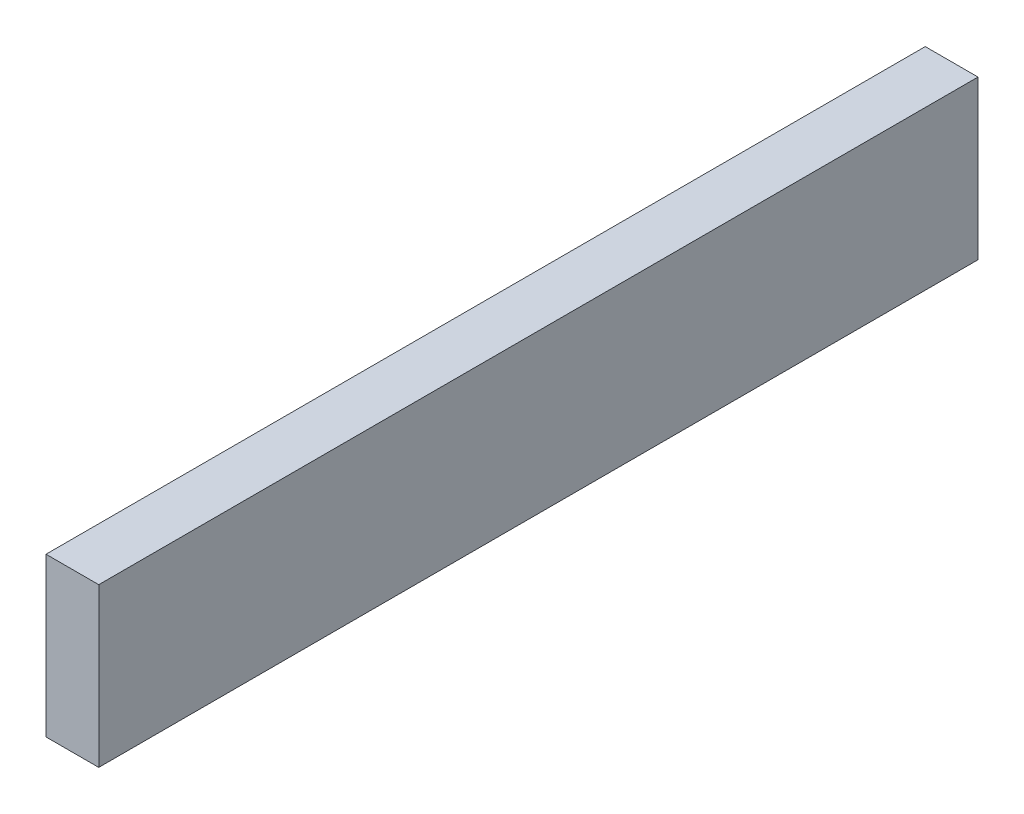
ISO-10303-21;
HEADER;
FILE_DESCRIPTION(('STEP AP214'),'2;1');
FILE_NAME('part.step','',(''),(''),'','','');
FILE_SCHEMA(('AUTOMOTIVE_DESIGN { 1 0 10303 214 1 1 1 1 }'));
ENDSEC;
DATA;
#1=APPLICATION_CONTEXT('core data for automotive mechanical design processes');
#2=APPLICATION_PROTOCOL_DEFINITION('international standard','automotive_design',2000,#1);
#3=PRODUCT_CONTEXT('',#1,'mechanical');
#4=PRODUCT('Part','Part','',(#3));
#5=PRODUCT_RELATED_PRODUCT_CATEGORY('part','',(#4));
#6=PRODUCT_DEFINITION_FORMATION('','',#4);
#7=PRODUCT_DEFINITION_CONTEXT('part definition',#1,'design');
#8=PRODUCT_DEFINITION('design','',#6,#7);
#9=PRODUCT_DEFINITION_SHAPE('','',#8);
#10=(LENGTH_UNIT() NAMED_UNIT(*) SI_UNIT(.MILLI.,.METRE.));
#11=(NAMED_UNIT(*) PLANE_ANGLE_UNIT() SI_UNIT($,.RADIAN.));
#12=(NAMED_UNIT(*) SI_UNIT($,.STERADIAN.) SOLID_ANGLE_UNIT());
#13=UNCERTAINTY_MEASURE_WITH_UNIT(LENGTH_MEASURE(1.E-05),#10,'distance_accuracy_value','');
#14=(GEOMETRIC_REPRESENTATION_CONTEXT(3) GLOBAL_UNCERTAINTY_ASSIGNED_CONTEXT((#13)) GLOBAL_UNIT_ASSIGNED_CONTEXT((#10,
#11,#12)) REPRESENTATION_CONTEXT('',''));
#15=CARTESIAN_POINT('',(0.,0.,0.));
#16=DIRECTION('',(0.,0.,1.));
#17=DIRECTION('',(1.,0.,0.));
#18=AXIS2_PLACEMENT_3D('',#15,#16,#17);
#19=CARTESIAN_POINT('',(15.,-45.,250.));
#20=DIRECTION('',(-1.,0.,0.));
#21=DIRECTION('',(0.,0.,1.));
#22=AXIS2_PLACEMENT_3D('',#19,#20,#21);
#23=PLANE('',#22);
#24=DIRECTION('',(0.,1.,0.));
#25=VECTOR('',#24,1.);
#26=CARTESIAN_POINT('',(15.,-45.,-250.));
#27=LINE('',#26,#25);
#28=CARTESIAN_POINT('',(15.,-45.,-250.));
#29=VERTEX_POINT('',#28);
#30=CARTESIAN_POINT('',(15.,45.,-250.));
#31=VERTEX_POINT('',#30);
#32=EDGE_CURVE('E96',#29,#31,#27,.T.);
#33=ORIENTED_EDGE('',*,*,#32,.T.);
#34=DIRECTION('',(0.,0.,-1.));
#35=VECTOR('',#34,1.);
#36=CARTESIAN_POINT('',(15.,45.,250.));
#37=LINE('',#36,#35);
#38=CARTESIAN_POINT('',(15.,45.,250.));
#39=VERTEX_POINT('',#38);
#40=EDGE_CURVE('E11',#39,#31,#37,.T.);
#41=ORIENTED_EDGE('',*,*,#40,.F.);
#42=DIRECTION('',(0.,1.,0.));
#43=VECTOR('',#42,1.);
#44=CARTESIAN_POINT('',(15.,-45.,250.));
#45=LINE('',#44,#43);
#46=CARTESIAN_POINT('',(15.,-45.,250.));
#47=VERTEX_POINT('',#46);
#48=EDGE_CURVE('E84',#47,#39,#45,.T.);
#49=ORIENTED_EDGE('',*,*,#48,.F.);
#50=DIRECTION('',(0.,0.,-1.));
#51=VECTOR('',#50,1.);
#52=CARTESIAN_POINT('',(15.,-45.,250.));
#53=LINE('',#52,#51);
#54=EDGE_CURVE('E92',#47,#29,#53,.T.);
#55=ORIENTED_EDGE('',*,*,#54,.T.);
#56=EDGE_LOOP('',(#33,#41,#49,#55));
#57=FACE_BOUND('',#56,.T.);
#58=ADVANCED_FACE('F33',(#57),#23,.F.);
#59=CARTESIAN_POINT('',(-15.,45.,250.));
#60=DIRECTION('',(0.,-1.,0.));
#61=DIRECTION('',(0.,0.,-1.));
#62=AXIS2_PLACEMENT_3D('',#59,#60,#61);
#63=PLANE('',#62);
#64=DIRECTION('',(-1.,0.,0.));
#65=VECTOR('',#64,1.);
#66=CARTESIAN_POINT('',(-15.,45.,-250.));
#67=LINE('',#66,#65);
#68=CARTESIAN_POINT('',(-15.,45.,-250.));
#69=VERTEX_POINT('',#68);
#70=EDGE_CURVE('E88',#31,#69,#67,.T.);
#71=ORIENTED_EDGE('',*,*,#70,.T.);
#72=DIRECTION('',(0.,0.,-1.));
#73=VECTOR('',#72,1.);
#74=CARTESIAN_POINT('',(-15.,45.,250.));
#75=LINE('',#74,#73);
#76=CARTESIAN_POINT('',(-15.,45.,250.));
#77=VERTEX_POINT('',#76);
#78=EDGE_CURVE('E41',#77,#69,#75,.T.);
#79=ORIENTED_EDGE('',*,*,#78,.F.);
#80=DIRECTION('',(-1.,0.,0.));
#81=VECTOR('',#80,1.);
#82=CARTESIAN_POINT('',(-15.,45.,250.));
#83=LINE('',#82,#81);
#84=EDGE_CURVE('E79',#39,#77,#83,.T.);
#85=ORIENTED_EDGE('',*,*,#84,.F.);
#86=ORIENTED_EDGE('',*,*,#40,.T.);
#87=EDGE_LOOP('',(#71,#79,#85,#86));
#88=FACE_BOUND('',#87,.T.);
#89=ADVANCED_FACE('F87',(#88),#63,.F.);
#90=CARTESIAN_POINT('',(-15.,-45.,250.));
#91=DIRECTION('',(1.,0.,0.));
#92=DIRECTION('',(0.,0.,-1.));
#93=AXIS2_PLACEMENT_3D('',#90,#91,#92);
#94=PLANE('',#93);
#95=DIRECTION('',(0.,-1.,0.));
#96=VECTOR('',#95,1.);
#97=CARTESIAN_POINT('',(-15.,-45.,-250.));
#98=LINE('',#97,#96);
#99=CARTESIAN_POINT('',(-15.,-45.,-250.));
#100=VERTEX_POINT('',#99);
#101=EDGE_CURVE('E66',#69,#100,#98,.T.);
#102=ORIENTED_EDGE('',*,*,#101,.T.);
#103=DIRECTION('',(0.,0.,-1.));
#104=VECTOR('',#103,1.);
#105=CARTESIAN_POINT('',(-15.,-45.,250.));
#106=LINE('',#105,#104);
#107=CARTESIAN_POINT('',(-15.,-45.,250.));
#108=VERTEX_POINT('',#107);
#109=EDGE_CURVE('E89',#108,#100,#106,.T.);
#110=ORIENTED_EDGE('',*,*,#109,.F.);
#111=DIRECTION('',(0.,-1.,0.));
#112=VECTOR('',#111,1.);
#113=CARTESIAN_POINT('',(-15.,-45.,250.));
#114=LINE('',#113,#112);
#115=EDGE_CURVE('E82',#77,#108,#114,.T.);
#116=ORIENTED_EDGE('',*,*,#115,.F.);
#117=ORIENTED_EDGE('',*,*,#78,.T.);
#118=EDGE_LOOP('',(#102,#110,#116,#117));
#119=FACE_BOUND('',#118,.T.);
#120=ADVANCED_FACE('F90',(#119),#94,.F.);
#121=CARTESIAN_POINT('',(-15.,-45.,250.));
#122=DIRECTION('',(0.,1.,0.));
#123=DIRECTION('',(0.,0.,1.));
#124=AXIS2_PLACEMENT_3D('',#121,#122,#123);
#125=PLANE('',#124);
#126=DIRECTION('',(1.,0.,0.));
#127=VECTOR('',#126,1.);
#128=CARTESIAN_POINT('',(-15.,-45.,-250.));
#129=LINE('',#128,#127);
#130=EDGE_CURVE('E72',#100,#29,#129,.T.);
#131=ORIENTED_EDGE('',*,*,#130,.T.);
#132=ORIENTED_EDGE('',*,*,#54,.F.);
#133=DIRECTION('',(1.,0.,0.));
#134=VECTOR('',#133,1.);
#135=CARTESIAN_POINT('',(-15.,-45.,250.));
#136=LINE('',#135,#134);
#137=EDGE_CURVE('E49',#108,#47,#136,.T.);
#138=ORIENTED_EDGE('',*,*,#137,.F.);
#139=ORIENTED_EDGE('',*,*,#109,.T.);
#140=EDGE_LOOP('',(#131,#132,#138,#139));
#141=FACE_BOUND('',#140,.T.);
#142=ADVANCED_FACE('F103',(#141),#125,.F.);
#143=CARTESIAN_POINT('',(0.,0.,250.));
#144=DIRECTION('',(0.,0.,-1.));
#145=DIRECTION('',(-1.,0.,0.));
#146=AXIS2_PLACEMENT_3D('',#143,#144,#145);
#147=PLANE('',#146);
#148=ORIENTED_EDGE('',*,*,#48,.T.);
#149=ORIENTED_EDGE('',*,*,#84,.T.);
#150=ORIENTED_EDGE('',*,*,#115,.T.);
#151=ORIENTED_EDGE('',*,*,#137,.T.);
#152=EDGE_LOOP('',(#148,#149,#150,#151));
#153=FACE_BOUND('',#152,.T.);
#154=ADVANCED_FACE('F80',(#153),#147,.F.);
#155=CARTESIAN_POINT('',(0.,0.,-250.));
#156=DIRECTION('',(0.,0.,-1.));
#157=DIRECTION('',(-1.,0.,0.));
#158=AXIS2_PLACEMENT_3D('',#155,#156,#157);
#159=PLANE('',#158);
#160=ORIENTED_EDGE('',*,*,#32,.F.);
#161=ORIENTED_EDGE('',*,*,#130,.F.);
#162=ORIENTED_EDGE('',*,*,#101,.F.);
#163=ORIENTED_EDGE('',*,*,#70,.F.);
#164=EDGE_LOOP('',(#160,#161,#162,#163));
#165=FACE_BOUND('',#164,.T.);
#166=ADVANCED_FACE('F106',(#165),#159,.T.);
#167=CLOSED_SHELL('',(#58,#89,#120,#142,#154,#166));
#168=MANIFOLD_SOLID_BREP('B2',#167);
#169=ADVANCED_BREP_SHAPE_REPRESENTATION('',(#18,#168),#14);
#170=SHAPE_DEFINITION_REPRESENTATION(#9,#169);
ENDSEC;
END-ISO-10303-21;
